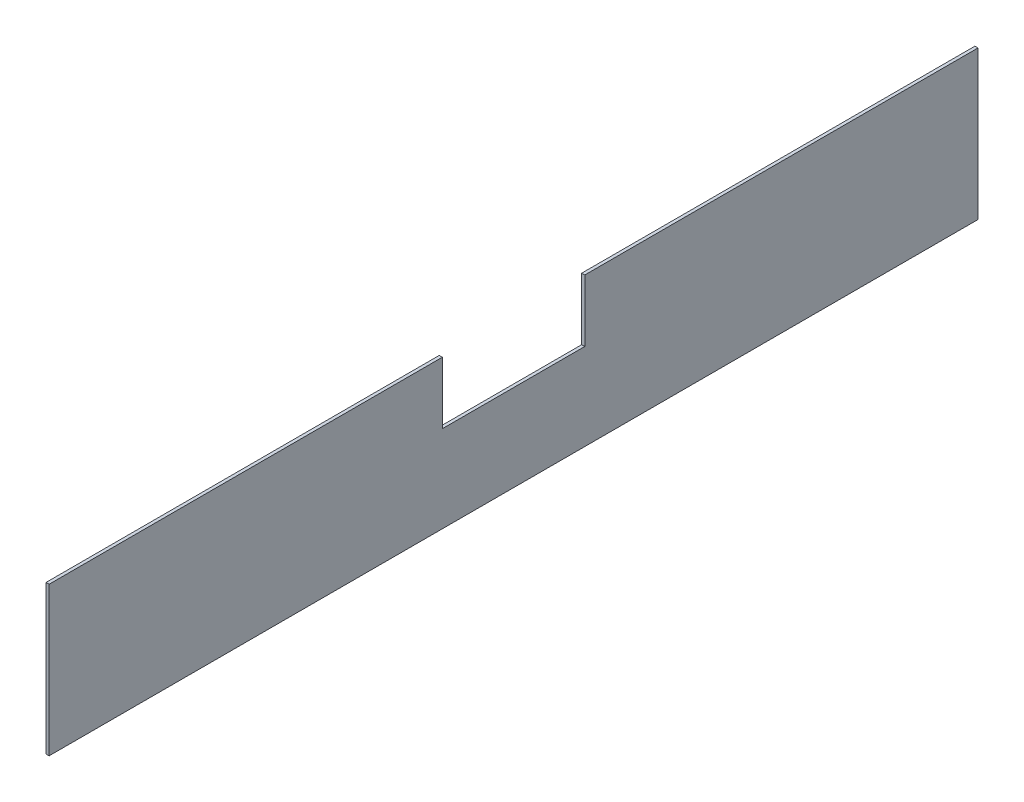
ISO-10303-21;
HEADER;
FILE_DESCRIPTION(('STEP AP214'),'2;1');
FILE_NAME('part.step','',(''),(''),'','','');
FILE_SCHEMA(('AUTOMOTIVE_DESIGN { 1 0 10303 214 1 1 1 1 }'));
ENDSEC;
DATA;
#1=APPLICATION_CONTEXT('core data for automotive mechanical design processes');
#2=APPLICATION_PROTOCOL_DEFINITION('international standard','automotive_design',2000,#1);
#3=PRODUCT_CONTEXT('',#1,'mechanical');
#4=PRODUCT('Part','Part','',(#3));
#5=PRODUCT_RELATED_PRODUCT_CATEGORY('part','',(#4));
#6=PRODUCT_DEFINITION_FORMATION('','',#4);
#7=PRODUCT_DEFINITION_CONTEXT('part definition',#1,'design');
#8=PRODUCT_DEFINITION('design','',#6,#7);
#9=PRODUCT_DEFINITION_SHAPE('','',#8);
#10=(LENGTH_UNIT() NAMED_UNIT(*) SI_UNIT(.MILLI.,.METRE.));
#11=(NAMED_UNIT(*) PLANE_ANGLE_UNIT() SI_UNIT($,.RADIAN.));
#12=(NAMED_UNIT(*) SI_UNIT($,.STERADIAN.) SOLID_ANGLE_UNIT());
#13=UNCERTAINTY_MEASURE_WITH_UNIT(LENGTH_MEASURE(1.E-05),#10,'distance_accuracy_value','');
#14=(GEOMETRIC_REPRESENTATION_CONTEXT(3) GLOBAL_UNCERTAINTY_ASSIGNED_CONTEXT((#13)) GLOBAL_UNIT_ASSIGNED_CONTEXT((#10,
#11,#12)) REPRESENTATION_CONTEXT('',''));
#15=CARTESIAN_POINT('',(0.,0.,0.));
#16=DIRECTION('',(0.,0.,1.));
#17=DIRECTION('',(1.,0.,0.));
#18=AXIS2_PLACEMENT_3D('',#15,#16,#17);
#19=CARTESIAN_POINT('',(-126.,60.001,150.));
#20=DIRECTION('',(0.,1.,0.));
#21=DIRECTION('',(0.,0.,1.));
#22=AXIS2_PLACEMENT_3D('',#19,#20,#21);
#23=PLANE('',#22);
#24=DIRECTION('',(-1.,0.,0.));
#25=VECTOR('',#24,1.);
#26=CARTESIAN_POINT('',(-116.,60.001,-23.));
#27=LINE('',#26,#25);
#28=CARTESIAN_POINT('',(-125.,60.001,-23.));
#29=VERTEX_POINT('',#28);
#30=CARTESIAN_POINT('',(-126.,60.001,-23.));
#31=VERTEX_POINT('',#30);
#32=EDGE_CURVE('E117',#29,#31,#27,.T.);
#33=ORIENTED_EDGE('',*,*,#32,.F.);
#34=DIRECTION('',(0.,0.,1.));
#35=VECTOR('',#34,1.);
#36=CARTESIAN_POINT('',(-125.,60.001,150.));
#37=LINE('',#36,#35);
#38=CARTESIAN_POINT('',(-125.,60.001,-150.));
#39=VERTEX_POINT('',#38);
#40=EDGE_CURVE('E145',#39,#29,#37,.T.);
#41=ORIENTED_EDGE('',*,*,#40,.F.);
#42=DIRECTION('',(1.,0.,0.));
#43=VECTOR('',#42,1.);
#44=CARTESIAN_POINT('',(-126.,60.001,-150.));
#45=LINE('',#44,#43);
#46=CARTESIAN_POINT('',(-126.,60.001,-150.));
#47=VERTEX_POINT('',#46);
#48=EDGE_CURVE('E150',#47,#39,#45,.T.);
#49=ORIENTED_EDGE('',*,*,#48,.F.);
#50=DIRECTION('',(0.,0.,1.));
#51=VECTOR('',#50,1.);
#52=CARTESIAN_POINT('',(-126.,60.001,150.));
#53=LINE('',#52,#51);
#54=EDGE_CURVE('E148',#47,#31,#53,.T.);
#55=ORIENTED_EDGE('',*,*,#54,.T.);
#56=EDGE_LOOP('',(#33,#41,#49,#55));
#57=FACE_BOUND('',#56,.T.);
#58=ADVANCED_FACE('F39',(#57),#23,.T.);
#59=CARTESIAN_POINT('',(-126.,-60.,150.));
#60=DIRECTION('',(0.,0.,1.));
#61=DIRECTION('',(0.,-1.,0.));
#62=AXIS2_PLACEMENT_3D('',#59,#60,#61);
#63=PLANE('',#62);
#64=DIRECTION('',(1.,0.,0.));
#65=VECTOR('',#64,1.);
#66=CARTESIAN_POINT('',(-135.,12.,150.));
#67=LINE('',#66,#65);
#68=CARTESIAN_POINT('',(-126.,12.,150.));
#69=VERTEX_POINT('',#68);
#70=CARTESIAN_POINT('',(-125.,12.,150.));
#71=VERTEX_POINT('',#70);
#72=EDGE_CURVE('E134',#69,#71,#67,.T.);
#73=ORIENTED_EDGE('',*,*,#72,.T.);
#74=DIRECTION('',(0.,-1.,0.));
#75=VECTOR('',#74,1.);
#76=CARTESIAN_POINT('',(-125.,-60.,150.));
#77=LINE('',#76,#75);
#78=CARTESIAN_POINT('',(-125.,60.001,150.));
#79=VERTEX_POINT('',#78);
#80=EDGE_CURVE('E140',#79,#71,#77,.T.);
#81=ORIENTED_EDGE('',*,*,#80,.F.);
#82=DIRECTION('',(1.,0.,0.));
#83=VECTOR('',#82,1.);
#84=CARTESIAN_POINT('',(-126.,60.001,150.));
#85=LINE('',#84,#83);
#86=CARTESIAN_POINT('',(-126.,60.001,150.));
#87=VERTEX_POINT('',#86);
#88=EDGE_CURVE('E158',#87,#79,#85,.T.);
#89=ORIENTED_EDGE('',*,*,#88,.F.);
#90=DIRECTION('',(0.,-1.,0.));
#91=VECTOR('',#90,1.);
#92=CARTESIAN_POINT('',(-126.,-60.,150.));
#93=LINE('',#92,#91);
#94=EDGE_CURVE('E141',#87,#69,#93,.T.);
#95=ORIENTED_EDGE('',*,*,#94,.T.);
#96=EDGE_LOOP('',(#73,#81,#89,#95));
#97=FACE_BOUND('',#96,.T.);
#98=ADVANCED_FACE('F41',(#97),#63,.T.);
#99=DIRECTION('',(-1.,0.,0.));
#100=VECTOR('',#99,1.);
#101=CARTESIAN_POINT('',(-116.,60.001,23.));
#102=LINE('',#101,#100);
#103=CARTESIAN_POINT('',(-125.,60.001,23.));
#104=VERTEX_POINT('',#103);
#105=CARTESIAN_POINT('',(-126.,60.001,23.));
#106=VERTEX_POINT('',#105);
#107=EDGE_CURVE('E129',#104,#106,#102,.T.);
#108=ORIENTED_EDGE('',*,*,#107,.T.);
#109=EDGE_CURVE('E147',#106,#87,#53,.T.);
#110=ORIENTED_EDGE('',*,*,#109,.T.);
#111=ORIENTED_EDGE('',*,*,#88,.T.);
#112=EDGE_CURVE('E155',#104,#79,#37,.T.);
#113=ORIENTED_EDGE('',*,*,#112,.F.);
#114=EDGE_LOOP('',(#108,#110,#111,#113));
#115=FACE_BOUND('',#114,.T.);
#116=ADVANCED_FACE('F169',(#115),#23,.T.);
#117=CARTESIAN_POINT('',(-126.,-60.,-150.));
#118=DIRECTION('',(0.,0.,-1.));
#119=DIRECTION('',(0.,1.,0.));
#120=AXIS2_PLACEMENT_3D('',#117,#118,#119);
#121=PLANE('',#120);
#122=DIRECTION('',(1.,0.,0.));
#123=VECTOR('',#122,1.);
#124=CARTESIAN_POINT('',(-135.,12.,-150.));
#125=LINE('',#124,#123);
#126=CARTESIAN_POINT('',(-126.,12.,-150.));
#127=VERTEX_POINT('',#126);
#128=CARTESIAN_POINT('',(-125.,12.,-150.));
#129=VERTEX_POINT('',#128);
#130=EDGE_CURVE('E62',#127,#129,#125,.T.);
#131=ORIENTED_EDGE('',*,*,#130,.F.);
#132=DIRECTION('',(0.,1.,0.));
#133=VECTOR('',#132,1.);
#134=CARTESIAN_POINT('',(-126.,-60.,-150.));
#135=LINE('',#134,#133);
#136=EDGE_CURVE('E144',#127,#47,#135,.T.);
#137=ORIENTED_EDGE('',*,*,#136,.T.);
#138=ORIENTED_EDGE('',*,*,#48,.T.);
#139=DIRECTION('',(0.,1.,0.));
#140=VECTOR('',#139,1.);
#141=CARTESIAN_POINT('',(-125.,-60.,-150.));
#142=LINE('',#141,#140);
#143=EDGE_CURVE('E153',#129,#39,#142,.T.);
#144=ORIENTED_EDGE('',*,*,#143,.F.);
#145=EDGE_LOOP('',(#131,#137,#138,#144));
#146=FACE_BOUND('',#145,.T.);
#147=ADVANCED_FACE('F176',(#146),#121,.T.);
#148=CARTESIAN_POINT('',(-126.,0.,0.));
#149=DIRECTION('',(-1.,0.,0.));
#150=DIRECTION('',(0.,0.,1.));
#151=AXIS2_PLACEMENT_3D('',#148,#149,#150);
#152=PLANE('',#151);
#153=DIRECTION('',(0.,-1.,0.));
#154=VECTOR('',#153,1.);
#155=CARTESIAN_POINT('',(-126.,60.001,-23.));
#156=LINE('',#155,#154);
#157=CARTESIAN_POINT('',(-126.,40.001,-23.));
#158=VERTEX_POINT('',#157);
#159=EDGE_CURVE('E114',#31,#158,#156,.T.);
#160=ORIENTED_EDGE('',*,*,#159,.F.);
#161=ORIENTED_EDGE('',*,*,#54,.F.);
#162=ORIENTED_EDGE('',*,*,#136,.F.);
#163=DIRECTION('',(0.,0.,-1.));
#164=VECTOR('',#163,1.);
#165=CARTESIAN_POINT('',(-126.,12.,0.));
#166=LINE('',#165,#164);
#167=EDGE_CURVE('E137',#69,#127,#166,.T.);
#168=ORIENTED_EDGE('',*,*,#167,.F.);
#169=ORIENTED_EDGE('',*,*,#94,.F.);
#170=ORIENTED_EDGE('',*,*,#109,.F.);
#171=DIRECTION('',(0.,1.,0.));
#172=VECTOR('',#171,1.);
#173=CARTESIAN_POINT('',(-126.,60.001,23.));
#174=LINE('',#173,#172);
#175=CARTESIAN_POINT('',(-126.,40.001,23.));
#176=VERTEX_POINT('',#175);
#177=EDGE_CURVE('E111',#176,#106,#174,.T.);
#178=ORIENTED_EDGE('',*,*,#177,.F.);
#179=DIRECTION('',(0.,0.,1.));
#180=VECTOR('',#179,1.);
#181=CARTESIAN_POINT('',(-126.,40.001,-23.));
#182=LINE('',#181,#180);
#183=EDGE_CURVE('E106',#158,#176,#182,.T.);
#184=ORIENTED_EDGE('',*,*,#183,.F.);
#185=EDGE_LOOP('',(#160,#161,#162,#168,#169,#170,#178,#184));
#186=FACE_BOUND('',#185,.T.);
#187=ADVANCED_FACE('F122',(#186),#152,.T.);
#188=CARTESIAN_POINT('',(-125.,0.,0.));
#189=DIRECTION('',(-1.,0.,0.));
#190=DIRECTION('',(0.,0.,1.));
#191=AXIS2_PLACEMENT_3D('',#188,#189,#190);
#192=PLANE('',#191);
#193=ORIENTED_EDGE('',*,*,#40,.T.);
#194=DIRECTION('',(0.,-1.,0.));
#195=VECTOR('',#194,1.);
#196=CARTESIAN_POINT('',(-125.,0.,-22.9999999999999));
#197=LINE('',#196,#195);
#198=CARTESIAN_POINT('',(-125.,40.001,-23.));
#199=VERTEX_POINT('',#198);
#200=EDGE_CURVE('E11',#29,#199,#197,.T.);
#201=ORIENTED_EDGE('',*,*,#200,.T.);
#202=DIRECTION('',(0.,0.,1.));
#203=VECTOR('',#202,1.);
#204=CARTESIAN_POINT('',(-125.,40.001,0.));
#205=LINE('',#204,#203);
#206=CARTESIAN_POINT('',(-125.,40.001,23.));
#207=VERTEX_POINT('',#206);
#208=EDGE_CURVE('E109',#199,#207,#205,.T.);
#209=ORIENTED_EDGE('',*,*,#208,.T.);
#210=DIRECTION('',(0.,1.,0.));
#211=VECTOR('',#210,1.);
#212=CARTESIAN_POINT('',(-125.,0.,23.));
#213=LINE('',#212,#211);
#214=EDGE_CURVE('E47',#207,#104,#213,.T.);
#215=ORIENTED_EDGE('',*,*,#214,.T.);
#216=ORIENTED_EDGE('',*,*,#112,.T.);
#217=ORIENTED_EDGE('',*,*,#80,.T.);
#218=DIRECTION('',(0.,0.,1.));
#219=VECTOR('',#218,1.);
#220=CARTESIAN_POINT('',(-125.,12.,150.));
#221=LINE('',#220,#219);
#222=EDGE_CURVE('E128',#129,#71,#221,.T.);
#223=ORIENTED_EDGE('',*,*,#222,.F.);
#224=ORIENTED_EDGE('',*,*,#143,.T.);
#225=EDGE_LOOP('',(#193,#201,#209,#215,#216,#217,#223,#224));
#226=FACE_BOUND('',#225,.T.);
#227=ADVANCED_FACE('F166',(#226),#192,.F.);
#228=CARTESIAN_POINT('',(-135.,12.,150.));
#229=DIRECTION('',(0.,1.,0.));
#230=DIRECTION('',(0.,0.,1.));
#231=AXIS2_PLACEMENT_3D('',#228,#229,#230);
#232=PLANE('',#231);
#233=ORIENTED_EDGE('',*,*,#167,.T.);
#234=ORIENTED_EDGE('',*,*,#130,.T.);
#235=ORIENTED_EDGE('',*,*,#222,.T.);
#236=ORIENTED_EDGE('',*,*,#72,.F.);
#237=EDGE_LOOP('',(#233,#234,#235,#236));
#238=FACE_BOUND('',#237,.T.);
#239=ADVANCED_FACE('F182',(#238),#232,.F.);
#240=CARTESIAN_POINT('',(-116.,60.001,-23.));
#241=DIRECTION('',(0.,0.,-1.));
#242=DIRECTION('',(0.,1.,0.));
#243=AXIS2_PLACEMENT_3D('',#240,#241,#242);
#244=PLANE('',#243);
#245=ORIENTED_EDGE('',*,*,#32,.T.);
#246=ORIENTED_EDGE('',*,*,#159,.T.);
#247=DIRECTION('',(-1.,0.,0.));
#248=VECTOR('',#247,1.);
#249=CARTESIAN_POINT('',(-116.,40.001,-23.));
#250=LINE('',#249,#248);
#251=EDGE_CURVE('E102',#199,#158,#250,.T.);
#252=ORIENTED_EDGE('',*,*,#251,.F.);
#253=ORIENTED_EDGE('',*,*,#200,.F.);
#254=EDGE_LOOP('',(#245,#246,#252,#253));
#255=FACE_BOUND('',#254,.T.);
#256=ADVANCED_FACE('F115',(#255),#244,.F.);
#257=CARTESIAN_POINT('',(-116.,60.001,23.));
#258=DIRECTION('',(0.,0.,1.));
#259=DIRECTION('',(1.,0.,0.));
#260=AXIS2_PLACEMENT_3D('',#257,#258,#259);
#261=PLANE('',#260);
#262=DIRECTION('',(-1.,0.,0.));
#263=VECTOR('',#262,1.);
#264=CARTESIAN_POINT('',(-116.,40.001,23.));
#265=LINE('',#264,#263);
#266=EDGE_CURVE('E54',#207,#176,#265,.T.);
#267=ORIENTED_EDGE('',*,*,#266,.T.);
#268=ORIENTED_EDGE('',*,*,#177,.T.);
#269=ORIENTED_EDGE('',*,*,#107,.F.);
#270=ORIENTED_EDGE('',*,*,#214,.F.);
#271=EDGE_LOOP('',(#267,#268,#269,#270));
#272=FACE_BOUND('',#271,.T.);
#273=ADVANCED_FACE('F190',(#272),#261,.F.);
#274=CARTESIAN_POINT('',(-116.,40.001,-23.));
#275=DIRECTION('',(0.,-1.,0.));
#276=DIRECTION('',(0.,0.,-1.));
#277=AXIS2_PLACEMENT_3D('',#274,#275,#276);
#278=PLANE('',#277);
#279=ORIENTED_EDGE('',*,*,#251,.T.);
#280=ORIENTED_EDGE('',*,*,#183,.T.);
#281=ORIENTED_EDGE('',*,*,#266,.F.);
#282=ORIENTED_EDGE('',*,*,#208,.F.);
#283=EDGE_LOOP('',(#279,#280,#281,#282));
#284=FACE_BOUND('',#283,.T.);
#285=ADVANCED_FACE('F104',(#284),#278,.F.);
#286=CLOSED_SHELL('',(#58,#98,#116,#147,#187,#227,#239,#256,#273,#285));
#287=MANIFOLD_SOLID_BREP('B2',#286);
#288=ADVANCED_BREP_SHAPE_REPRESENTATION('',(#18,#287),#14);
#289=SHAPE_DEFINITION_REPRESENTATION(#9,#288);
ENDSEC;
END-ISO-10303-21;
